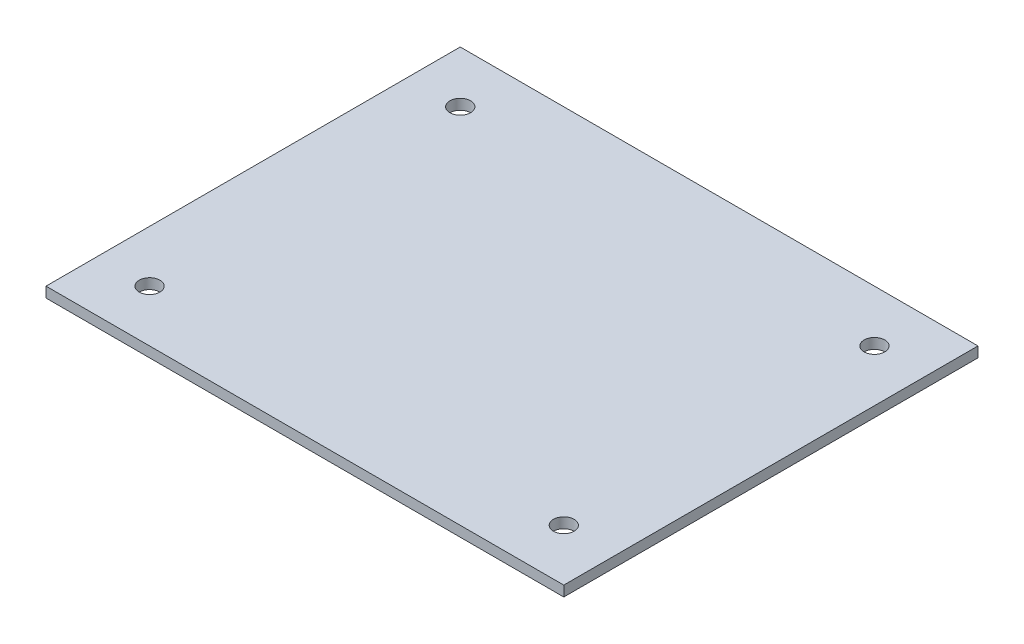
ISO-10303-21;
HEADER;
FILE_DESCRIPTION(('STEP AP214'),'2;1');
FILE_NAME('part.step','',(''),(''),'','','');
FILE_SCHEMA(('AUTOMOTIVE_DESIGN { 1 0 10303 214 1 1 1 1 }'));
ENDSEC;
DATA;
#1=APPLICATION_CONTEXT('core data for automotive mechanical design processes');
#2=APPLICATION_PROTOCOL_DEFINITION('international standard','automotive_design',2000,#1);
#3=PRODUCT_CONTEXT('',#1,'mechanical');
#4=PRODUCT('Part','Part','',(#3));
#5=PRODUCT_RELATED_PRODUCT_CATEGORY('part','',(#4));
#6=PRODUCT_DEFINITION_FORMATION('','',#4);
#7=PRODUCT_DEFINITION_CONTEXT('part definition',#1,'design');
#8=PRODUCT_DEFINITION('design','',#6,#7);
#9=PRODUCT_DEFINITION_SHAPE('','',#8);
#10=(LENGTH_UNIT() NAMED_UNIT(*) SI_UNIT(.MILLI.,.METRE.));
#11=(NAMED_UNIT(*) PLANE_ANGLE_UNIT() SI_UNIT($,.RADIAN.));
#12=(NAMED_UNIT(*) SI_UNIT($,.STERADIAN.) SOLID_ANGLE_UNIT());
#13=UNCERTAINTY_MEASURE_WITH_UNIT(LENGTH_MEASURE(1.E-05),#10,'distance_accuracy_value','');
#14=(GEOMETRIC_REPRESENTATION_CONTEXT(3) GLOBAL_UNCERTAINTY_ASSIGNED_CONTEXT((#13)) GLOBAL_UNIT_ASSIGNED_CONTEXT((#10,
#11,#12)) REPRESENTATION_CONTEXT('',''));
#15=CARTESIAN_POINT('',(0.,0.,0.));
#16=DIRECTION('',(0.,0.,1.));
#17=DIRECTION('',(1.,0.,0.));
#18=AXIS2_PLACEMENT_3D('',#15,#16,#17);
#19=CARTESIAN_POINT('',(-125.,5.,-100.));
#20=DIRECTION('',(1.,0.,0.));
#21=DIRECTION('',(0.,0.,-1.));
#22=AXIS2_PLACEMENT_3D('',#19,#20,#21);
#23=PLANE('',#22);
#24=DIRECTION('',(0.,0.,1.));
#25=VECTOR('',#24,1.);
#26=CARTESIAN_POINT('',(-125.,0.,-100.));
#27=LINE('',#26,#25);
#28=CARTESIAN_POINT('',(-125.,0.,-100.));
#29=VERTEX_POINT('',#28);
#30=CARTESIAN_POINT('',(-125.,0.,100.));
#31=VERTEX_POINT('',#30);
#32=EDGE_CURVE('E96',#29,#31,#27,.T.);
#33=ORIENTED_EDGE('',*,*,#32,.T.);
#34=DIRECTION('',(0.,-1.,0.));
#35=VECTOR('',#34,1.);
#36=CARTESIAN_POINT('',(-125.,5.,100.));
#37=LINE('',#36,#35);
#38=CARTESIAN_POINT('',(-125.,5.,100.));
#39=VERTEX_POINT('',#38);
#40=EDGE_CURVE('E11',#39,#31,#37,.T.);
#41=ORIENTED_EDGE('',*,*,#40,.F.);
#42=DIRECTION('',(0.,0.,1.));
#43=VECTOR('',#42,1.);
#44=CARTESIAN_POINT('',(-125.,5.,-100.));
#45=LINE('',#44,#43);
#46=CARTESIAN_POINT('',(-125.,5.,-100.));
#47=VERTEX_POINT('',#46);
#48=EDGE_CURVE('E84',#47,#39,#45,.T.);
#49=ORIENTED_EDGE('',*,*,#48,.F.);
#50=DIRECTION('',(0.,-1.,0.));
#51=VECTOR('',#50,1.);
#52=CARTESIAN_POINT('',(-125.,5.,-100.));
#53=LINE('',#52,#51);
#54=EDGE_CURVE('E92',#47,#29,#53,.T.);
#55=ORIENTED_EDGE('',*,*,#54,.T.);
#56=EDGE_LOOP('',(#33,#41,#49,#55));
#57=FACE_BOUND('',#56,.T.);
#58=ADVANCED_FACE('F33',(#57),#23,.F.);
#59=CARTESIAN_POINT('',(-125.,5.,100.));
#60=DIRECTION('',(0.,0.,-1.));
#61=DIRECTION('',(-1.,0.,0.));
#62=AXIS2_PLACEMENT_3D('',#59,#60,#61);
#63=PLANE('',#62);
#64=DIRECTION('',(1.,0.,0.));
#65=VECTOR('',#64,1.);
#66=CARTESIAN_POINT('',(-125.,0.,100.));
#67=LINE('',#66,#65);
#68=CARTESIAN_POINT('',(125.,0.,100.));
#69=VERTEX_POINT('',#68);
#70=EDGE_CURVE('E88',#31,#69,#67,.T.);
#71=ORIENTED_EDGE('',*,*,#70,.T.);
#72=DIRECTION('',(0.,-1.,0.));
#73=VECTOR('',#72,1.);
#74=CARTESIAN_POINT('',(125.,5.,100.));
#75=LINE('',#74,#73);
#76=CARTESIAN_POINT('',(125.,5.,100.));
#77=VERTEX_POINT('',#76);
#78=EDGE_CURVE('E41',#77,#69,#75,.T.);
#79=ORIENTED_EDGE('',*,*,#78,.F.);
#80=DIRECTION('',(1.,0.,0.));
#81=VECTOR('',#80,1.);
#82=CARTESIAN_POINT('',(-125.,5.,100.));
#83=LINE('',#82,#81);
#84=EDGE_CURVE('E79',#39,#77,#83,.T.);
#85=ORIENTED_EDGE('',*,*,#84,.F.);
#86=ORIENTED_EDGE('',*,*,#40,.T.);
#87=EDGE_LOOP('',(#71,#79,#85,#86));
#88=FACE_BOUND('',#87,.T.);
#89=ADVANCED_FACE('F87',(#88),#63,.F.);
#90=CARTESIAN_POINT('',(125.,5.,-100.));
#91=DIRECTION('',(-1.,0.,0.));
#92=DIRECTION('',(0.,0.,1.));
#93=AXIS2_PLACEMENT_3D('',#90,#91,#92);
#94=PLANE('',#93);
#95=DIRECTION('',(0.,0.,-1.));
#96=VECTOR('',#95,1.);
#97=CARTESIAN_POINT('',(125.,0.,-100.));
#98=LINE('',#97,#96);
#99=CARTESIAN_POINT('',(125.,0.,-100.));
#100=VERTEX_POINT('',#99);
#101=EDGE_CURVE('E66',#69,#100,#98,.T.);
#102=ORIENTED_EDGE('',*,*,#101,.T.);
#103=DIRECTION('',(0.,-1.,0.));
#104=VECTOR('',#103,1.);
#105=CARTESIAN_POINT('',(125.,5.,-100.));
#106=LINE('',#105,#104);
#107=CARTESIAN_POINT('',(125.,5.,-100.));
#108=VERTEX_POINT('',#107);
#109=EDGE_CURVE('E89',#108,#100,#106,.T.);
#110=ORIENTED_EDGE('',*,*,#109,.F.);
#111=DIRECTION('',(0.,0.,-1.));
#112=VECTOR('',#111,1.);
#113=CARTESIAN_POINT('',(125.,5.,-100.));
#114=LINE('',#113,#112);
#115=EDGE_CURVE('E82',#77,#108,#114,.T.);
#116=ORIENTED_EDGE('',*,*,#115,.F.);
#117=ORIENTED_EDGE('',*,*,#78,.T.);
#118=EDGE_LOOP('',(#102,#110,#116,#117));
#119=FACE_BOUND('',#118,.T.);
#120=ADVANCED_FACE('F90',(#119),#94,.F.);
#121=CARTESIAN_POINT('',(-125.,5.,-100.));
#122=DIRECTION('',(0.,0.,1.));
#123=DIRECTION('',(1.,0.,0.));
#124=AXIS2_PLACEMENT_3D('',#121,#122,#123);
#125=PLANE('',#124);
#126=DIRECTION('',(-1.,0.,0.));
#127=VECTOR('',#126,1.);
#128=CARTESIAN_POINT('',(-125.,0.,-100.));
#129=LINE('',#128,#127);
#130=EDGE_CURVE('E72',#100,#29,#129,.T.);
#131=ORIENTED_EDGE('',*,*,#130,.T.);
#132=ORIENTED_EDGE('',*,*,#54,.F.);
#133=DIRECTION('',(-1.,0.,0.));
#134=VECTOR('',#133,1.);
#135=CARTESIAN_POINT('',(-125.,5.,-100.));
#136=LINE('',#135,#134);
#137=EDGE_CURVE('E49',#108,#47,#136,.T.);
#138=ORIENTED_EDGE('',*,*,#137,.F.);
#139=ORIENTED_EDGE('',*,*,#109,.T.);
#140=EDGE_LOOP('',(#131,#132,#138,#139));
#141=FACE_BOUND('',#140,.T.);
#142=ADVANCED_FACE('F104',(#141),#125,.F.);
#143=CARTESIAN_POINT('',(0.,5.,0.));
#144=DIRECTION('',(0.,1.,0.));
#145=DIRECTION('',(0.,0.,1.));
#146=AXIS2_PLACEMENT_3D('',#143,#144,#145);
#147=PLANE('',#146);
#148=CARTESIAN_POINT('',(-100.,5.,75.));
#149=DIRECTION('',(0.,1.,0.));
#150=DIRECTION('',(0.,0.,-1.));
#151=AXIS2_PLACEMENT_3D('',#148,#149,#150);
#152=CIRCLE('',#151,5.00000000000001);
#153=CARTESIAN_POINT('',(-100.,5.,70.));
#154=VERTEX_POINT('',#153);
#155=EDGE_CURVE('E119',#154,#154,#152,.T.);
#156=ORIENTED_EDGE('',*,*,#155,.F.);
#157=EDGE_LOOP('',(#156));
#158=FACE_BOUND('',#157,.T.);
#159=CARTESIAN_POINT('',(100.,5.,75.));
#160=DIRECTION('',(0.,1.,0.));
#161=DIRECTION('',(0.,0.,1.));
#162=AXIS2_PLACEMENT_3D('',#159,#160,#161);
#163=CIRCLE('',#162,5.00000000000001);
#164=CARTESIAN_POINT('',(100.,5.,80.));
#165=VERTEX_POINT('',#164);
#166=EDGE_CURVE('E125',#165,#165,#163,.T.);
#167=ORIENTED_EDGE('',*,*,#166,.F.);
#168=EDGE_LOOP('',(#167));
#169=FACE_BOUND('',#168,.T.);
#170=CARTESIAN_POINT('',(100.,5.,-75.));
#171=DIRECTION('',(0.,1.,0.));
#172=DIRECTION('',(0.,0.,-1.));
#173=AXIS2_PLACEMENT_3D('',#170,#171,#172);
#174=CIRCLE('',#173,5.00000000000001);
#175=CARTESIAN_POINT('',(100.,5.,-80.));
#176=VERTEX_POINT('',#175);
#177=EDGE_CURVE('E113',#176,#176,#174,.T.);
#178=ORIENTED_EDGE('',*,*,#177,.F.);
#179=EDGE_LOOP('',(#178));
#180=FACE_BOUND('',#179,.T.);
#181=CARTESIAN_POINT('',(-100.,5.,-75.));
#182=DIRECTION('',(0.,1.,0.));
#183=DIRECTION('',(0.,0.,1.));
#184=AXIS2_PLACEMENT_3D('',#181,#182,#183);
#185=CIRCLE('',#184,5.00000000000001);
#186=CARTESIAN_POINT('',(-100.,5.,-70.));
#187=VERTEX_POINT('',#186);
#188=EDGE_CURVE('E99',#187,#187,#185,.T.);
#189=ORIENTED_EDGE('',*,*,#188,.F.);
#190=EDGE_LOOP('',(#189));
#191=FACE_BOUND('',#190,.T.);
#192=ORIENTED_EDGE('',*,*,#48,.T.);
#193=ORIENTED_EDGE('',*,*,#84,.T.);
#194=ORIENTED_EDGE('',*,*,#115,.T.);
#195=ORIENTED_EDGE('',*,*,#137,.T.);
#196=EDGE_LOOP('',(#192,#193,#194,#195));
#197=FACE_BOUND('',#196,.T.);
#198=ADVANCED_FACE('F80',(#158,#169,#180,#191,#197),#147,.T.);
#199=CARTESIAN_POINT('',(0.,0.,0.));
#200=DIRECTION('',(0.,1.,0.));
#201=DIRECTION('',(0.,0.,1.));
#202=AXIS2_PLACEMENT_3D('',#199,#200,#201);
#203=PLANE('',#202);
#204=CARTESIAN_POINT('',(-100.,0.,75.));
#205=DIRECTION('',(0.,1.,0.));
#206=DIRECTION('',(0.,0.,-1.));
#207=AXIS2_PLACEMENT_3D('',#204,#205,#206);
#208=CIRCLE('',#207,5.00000000000001);
#209=CARTESIAN_POINT('',(-100.,0.,70.));
#210=VERTEX_POINT('',#209);
#211=EDGE_CURVE('E116',#210,#210,#208,.T.);
#212=ORIENTED_EDGE('',*,*,#211,.T.);
#213=EDGE_LOOP('',(#212));
#214=FACE_BOUND('',#213,.T.);
#215=CARTESIAN_POINT('',(100.,0.,75.));
#216=DIRECTION('',(0.,1.,0.));
#217=DIRECTION('',(0.,0.,1.));
#218=AXIS2_PLACEMENT_3D('',#215,#216,#217);
#219=CIRCLE('',#218,5.00000000000001);
#220=CARTESIAN_POINT('',(100.,0.,80.));
#221=VERTEX_POINT('',#220);
#222=EDGE_CURVE('E122',#221,#221,#219,.T.);
#223=ORIENTED_EDGE('',*,*,#222,.T.);
#224=EDGE_LOOP('',(#223));
#225=FACE_BOUND('',#224,.T.);
#226=CARTESIAN_POINT('',(100.,0.,-75.));
#227=DIRECTION('',(0.,1.,0.));
#228=DIRECTION('',(0.,0.,-1.));
#229=AXIS2_PLACEMENT_3D('',#226,#227,#228);
#230=CIRCLE('',#229,5.00000000000001);
#231=CARTESIAN_POINT('',(100.,0.,-80.));
#232=VERTEX_POINT('',#231);
#233=EDGE_CURVE('E128',#232,#232,#230,.T.);
#234=ORIENTED_EDGE('',*,*,#233,.T.);
#235=EDGE_LOOP('',(#234));
#236=FACE_BOUND('',#235,.T.);
#237=CARTESIAN_POINT('',(-100.,0.,-75.));
#238=DIRECTION('',(0.,1.,0.));
#239=DIRECTION('',(0.,0.,1.));
#240=AXIS2_PLACEMENT_3D('',#237,#238,#239);
#241=CIRCLE('',#240,5.00000000000001);
#242=CARTESIAN_POINT('',(-100.,0.,-70.));
#243=VERTEX_POINT('',#242);
#244=EDGE_CURVE('E110',#243,#243,#241,.T.);
#245=ORIENTED_EDGE('',*,*,#244,.T.);
#246=EDGE_LOOP('',(#245));
#247=FACE_BOUND('',#246,.T.);
#248=ORIENTED_EDGE('',*,*,#32,.F.);
#249=ORIENTED_EDGE('',*,*,#130,.F.);
#250=ORIENTED_EDGE('',*,*,#101,.F.);
#251=ORIENTED_EDGE('',*,*,#70,.F.);
#252=EDGE_LOOP('',(#248,#249,#250,#251));
#253=FACE_BOUND('',#252,.T.);
#254=ADVANCED_FACE('F107',(#214,#225,#236,#247,#253),#203,.F.);
#255=CARTESIAN_POINT('',(-100.,5.,-75.));
#256=DIRECTION('',(0.,-1.,0.));
#257=DIRECTION('',(0.,0.,-1.));
#258=AXIS2_PLACEMENT_3D('',#255,#256,#257);
#259=CYLINDRICAL_SURFACE('',#258,5.00000000000001);
#260=ORIENTED_EDGE('',*,*,#188,.T.);
#261=EDGE_LOOP('',(#260));
#262=FACE_BOUND('',#261,.T.);
#263=ORIENTED_EDGE('',*,*,#244,.F.);
#264=EDGE_LOOP('',(#263));
#265=FACE_BOUND('',#264,.T.);
#266=ADVANCED_FACE('F143',(#262,#265),#259,.F.);
#267=CARTESIAN_POINT('',(100.,5.,-75.));
#268=DIRECTION('',(0.,-1.,0.));
#269=DIRECTION('',(0.,0.,-1.));
#270=AXIS2_PLACEMENT_3D('',#267,#268,#269);
#271=CYLINDRICAL_SURFACE('',#270,5.00000000000001);
#272=ORIENTED_EDGE('',*,*,#177,.T.);
#273=EDGE_LOOP('',(#272));
#274=FACE_BOUND('',#273,.T.);
#275=ORIENTED_EDGE('',*,*,#233,.F.);
#276=EDGE_LOOP('',(#275));
#277=FACE_BOUND('',#276,.T.);
#278=ADVANCED_FACE('F134',(#274,#277),#271,.F.);
#279=CARTESIAN_POINT('',(100.,5.,75.));
#280=DIRECTION('',(0.,-1.,0.));
#281=DIRECTION('',(0.,0.,-1.));
#282=AXIS2_PLACEMENT_3D('',#279,#280,#281);
#283=CYLINDRICAL_SURFACE('',#282,5.00000000000001);
#284=ORIENTED_EDGE('',*,*,#166,.T.);
#285=EDGE_LOOP('',(#284));
#286=FACE_BOUND('',#285,.T.);
#287=ORIENTED_EDGE('',*,*,#222,.F.);
#288=EDGE_LOOP('',(#287));
#289=FACE_BOUND('',#288,.T.);
#290=ADVANCED_FACE('F192',(#286,#289),#283,.F.);
#291=CARTESIAN_POINT('',(-100.,5.,75.));
#292=DIRECTION('',(0.,-1.,0.));
#293=DIRECTION('',(0.,0.,-1.));
#294=AXIS2_PLACEMENT_3D('',#291,#292,#293);
#295=CYLINDRICAL_SURFACE('',#294,5.00000000000001);
#296=ORIENTED_EDGE('',*,*,#155,.T.);
#297=EDGE_LOOP('',(#296));
#298=FACE_BOUND('',#297,.T.);
#299=ORIENTED_EDGE('',*,*,#211,.F.);
#300=EDGE_LOOP('',(#299));
#301=FACE_BOUND('',#300,.T.);
#302=ADVANCED_FACE('F201',(#298,#301),#295,.F.);
#303=CLOSED_SHELL('',(#58,#89,#120,#142,#198,#254,#266,#278,#290,#302));
#304=MANIFOLD_SOLID_BREP('B2',#303);
#305=ADVANCED_BREP_SHAPE_REPRESENTATION('',(#18,#304),#14);
#306=SHAPE_DEFINITION_REPRESENTATION(#9,#305);
ENDSEC;
END-ISO-10303-21;
